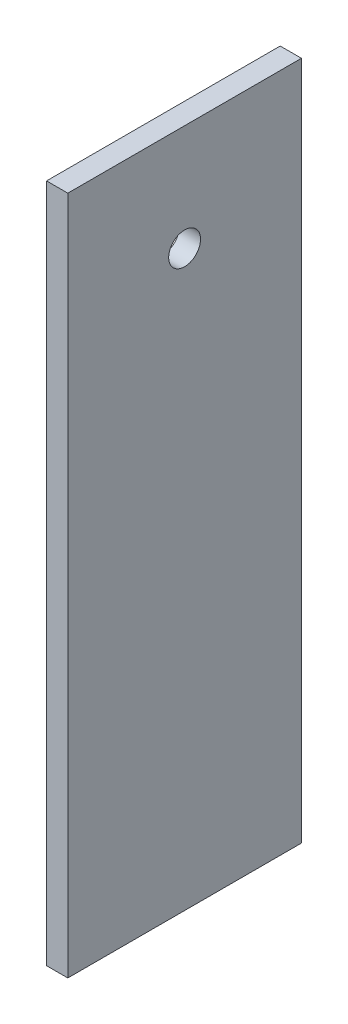
ISO-10303-21;
HEADER;
FILE_DESCRIPTION(('STEP AP214'),'2;1');
FILE_NAME('part.step','',(''),(''),'','','');
FILE_SCHEMA(('AUTOMOTIVE_DESIGN { 1 0 10303 214 1 1 1 1 }'));
ENDSEC;
DATA;
#1=APPLICATION_CONTEXT('core data for automotive mechanical design processes');
#2=APPLICATION_PROTOCOL_DEFINITION('international standard','automotive_design',2000,#1);
#3=PRODUCT_CONTEXT('',#1,'mechanical');
#4=PRODUCT('Part','Part','',(#3));
#5=PRODUCT_RELATED_PRODUCT_CATEGORY('part','',(#4));
#6=PRODUCT_DEFINITION_FORMATION('','',#4);
#7=PRODUCT_DEFINITION_CONTEXT('part definition',#1,'design');
#8=PRODUCT_DEFINITION('design','',#6,#7);
#9=PRODUCT_DEFINITION_SHAPE('','',#8);
#10=(LENGTH_UNIT() NAMED_UNIT(*) SI_UNIT(.MILLI.,.METRE.));
#11=(NAMED_UNIT(*) PLANE_ANGLE_UNIT() SI_UNIT($,.RADIAN.));
#12=(NAMED_UNIT(*) SI_UNIT($,.STERADIAN.) SOLID_ANGLE_UNIT());
#13=UNCERTAINTY_MEASURE_WITH_UNIT(LENGTH_MEASURE(1.E-05),#10,'distance_accuracy_value','');
#14=(GEOMETRIC_REPRESENTATION_CONTEXT(3) GLOBAL_UNCERTAINTY_ASSIGNED_CONTEXT((#13)) GLOBAL_UNIT_ASSIGNED_CONTEXT((#10,
#11,#12)) REPRESENTATION_CONTEXT('',''));
#15=CARTESIAN_POINT('',(0.,0.,0.));
#16=DIRECTION('',(0.,0.,1.));
#17=DIRECTION('',(1.,0.,0.));
#18=AXIS2_PLACEMENT_3D('',#15,#16,#17);
#19=CARTESIAN_POINT('',(50.,0.,0.));
#20=DIRECTION('',(1.,0.,0.));
#21=DIRECTION('',(0.,0.,-1.));
#22=AXIS2_PLACEMENT_3D('',#19,#20,#21);
#23=PLANE('',#22);
#24=DIRECTION('',(0.,1.,0.));
#25=VECTOR('',#24,1.);
#26=CARTESIAN_POINT('',(50.,800.,-275.));
#27=LINE('',#26,#25);
#28=CARTESIAN_POINT('',(50.,-800.,-275.));
#29=VERTEX_POINT('',#28);
#30=CARTESIAN_POINT('',(50.,800.,-275.));
#31=VERTEX_POINT('',#30);
#32=EDGE_CURVE('E102',#29,#31,#27,.T.);
#33=ORIENTED_EDGE('',*,*,#32,.T.);
#34=DIRECTION('',(0.,0.,1.));
#35=VECTOR('',#34,1.);
#36=CARTESIAN_POINT('',(50.,800.,275.));
#37=LINE('',#36,#35);
#38=CARTESIAN_POINT('',(50.,800.,275.));
#39=VERTEX_POINT('',#38);
#40=EDGE_CURVE('E97',#31,#39,#37,.T.);
#41=ORIENTED_EDGE('',*,*,#40,.T.);
#42=DIRECTION('',(0.,-1.,0.));
#43=VECTOR('',#42,1.);
#44=CARTESIAN_POINT('',(50.,800.,275.));
#45=LINE('',#44,#43);
#46=CARTESIAN_POINT('',(50.,-800.,275.));
#47=VERTEX_POINT('',#46);
#48=EDGE_CURVE('E100',#39,#47,#45,.T.);
#49=ORIENTED_EDGE('',*,*,#48,.T.);
#50=DIRECTION('',(0.,0.,-1.));
#51=VECTOR('',#50,1.);
#52=CARTESIAN_POINT('',(50.,-800.,275.));
#53=LINE('',#52,#51);
#54=EDGE_CURVE('E67',#47,#29,#53,.T.);
#55=ORIENTED_EDGE('',*,*,#54,.T.);
#56=EDGE_LOOP('',(#33,#41,#49,#55));
#57=FACE_BOUND('',#56,.T.);
#58=CARTESIAN_POINT('',(50.,550.,0.));
#59=DIRECTION('',(1.,0.,0.));
#60=DIRECTION('',(0.,0.,-1.));
#61=AXIS2_PLACEMENT_3D('',#58,#59,#60);
#62=CIRCLE('',#61,37.5);
#63=CARTESIAN_POINT('',(50.,550.,-37.5));
#64=VERTEX_POINT('',#63);
#65=EDGE_CURVE('E122',#64,#64,#62,.T.);
#66=ORIENTED_EDGE('',*,*,#65,.F.);
#67=EDGE_LOOP('',(#66));
#68=FACE_BOUND('',#67,.T.);
#69=ADVANCED_FACE('F49',(#57,#68),#23,.T.);
#70=CARTESIAN_POINT('',(0.,0.,0.));
#71=DIRECTION('',(1.,0.,0.));
#72=DIRECTION('',(0.,0.,-1.));
#73=AXIS2_PLACEMENT_3D('',#70,#71,#72);
#74=PLANE('',#73);
#75=DIRECTION('',(0.,1.,0.));
#76=VECTOR('',#75,1.);
#77=CARTESIAN_POINT('',(0.,800.,-275.));
#78=LINE('',#77,#76);
#79=CARTESIAN_POINT('',(0.,-800.,-275.));
#80=VERTEX_POINT('',#79);
#81=CARTESIAN_POINT('',(0.,800.,-275.));
#82=VERTEX_POINT('',#81);
#83=EDGE_CURVE('E118',#80,#82,#78,.T.);
#84=ORIENTED_EDGE('',*,*,#83,.F.);
#85=DIRECTION('',(0.,0.,-1.));
#86=VECTOR('',#85,1.);
#87=CARTESIAN_POINT('',(0.,-800.,275.));
#88=LINE('',#87,#86);
#89=CARTESIAN_POINT('',(0.,-800.,275.));
#90=VERTEX_POINT('',#89);
#91=EDGE_CURVE('E90',#90,#80,#88,.T.);
#92=ORIENTED_EDGE('',*,*,#91,.F.);
#93=DIRECTION('',(0.,-1.,0.));
#94=VECTOR('',#93,1.);
#95=CARTESIAN_POINT('',(0.,800.,275.));
#96=LINE('',#95,#94);
#97=CARTESIAN_POINT('',(0.,800.,275.));
#98=VERTEX_POINT('',#97);
#99=EDGE_CURVE('E84',#98,#90,#96,.T.);
#100=ORIENTED_EDGE('',*,*,#99,.F.);
#101=DIRECTION('',(0.,0.,1.));
#102=VECTOR('',#101,1.);
#103=CARTESIAN_POINT('',(0.,800.,275.));
#104=LINE('',#103,#102);
#105=EDGE_CURVE('E107',#82,#98,#104,.T.);
#106=ORIENTED_EDGE('',*,*,#105,.F.);
#107=EDGE_LOOP('',(#84,#92,#100,#106));
#108=FACE_BOUND('',#107,.T.);
#109=CARTESIAN_POINT('',(0.,550.,0.));
#110=DIRECTION('',(1.,0.,0.));
#111=DIRECTION('',(0.,0.,-1.));
#112=AXIS2_PLACEMENT_3D('',#109,#110,#111);
#113=CIRCLE('',#112,37.5);
#114=CARTESIAN_POINT('',(0.,550.,-37.5));
#115=VERTEX_POINT('',#114);
#116=EDGE_CURVE('E140',#115,#115,#113,.T.);
#117=ORIENTED_EDGE('',*,*,#116,.T.);
#118=EDGE_LOOP('',(#117));
#119=FACE_BOUND('',#118,.T.);
#120=ADVANCED_FACE('F135',(#108,#119),#74,.F.);
#121=CARTESIAN_POINT('',(50.,800.,-275.));
#122=DIRECTION('',(0.,0.,1.));
#123=DIRECTION('',(0.,-1.,0.));
#124=AXIS2_PLACEMENT_3D('',#121,#122,#123);
#125=PLANE('',#124);
#126=ORIENTED_EDGE('',*,*,#83,.T.);
#127=DIRECTION('',(-1.,0.,0.));
#128=VECTOR('',#127,1.);
#129=CARTESIAN_POINT('',(50.,800.,-275.));
#130=LINE('',#129,#128);
#131=EDGE_CURVE('E11',#31,#82,#130,.T.);
#132=ORIENTED_EDGE('',*,*,#131,.F.);
#133=ORIENTED_EDGE('',*,*,#32,.F.);
#134=DIRECTION('',(-1.,0.,0.));
#135=VECTOR('',#134,1.);
#136=CARTESIAN_POINT('',(50.,-800.,-275.));
#137=LINE('',#136,#135);
#138=EDGE_CURVE('E114',#29,#80,#137,.T.);
#139=ORIENTED_EDGE('',*,*,#138,.T.);
#140=EDGE_LOOP('',(#126,#132,#133,#139));
#141=FACE_BOUND('',#140,.T.);
#142=ADVANCED_FACE('F51',(#141),#125,.F.);
#143=CARTESIAN_POINT('',(50.,800.,275.));
#144=DIRECTION('',(0.,-1.,0.));
#145=DIRECTION('',(0.,0.,-1.));
#146=AXIS2_PLACEMENT_3D('',#143,#144,#145);
#147=PLANE('',#146);
#148=ORIENTED_EDGE('',*,*,#105,.T.);
#149=DIRECTION('',(-1.,0.,0.));
#150=VECTOR('',#149,1.);
#151=CARTESIAN_POINT('',(50.,800.,275.));
#152=LINE('',#151,#150);
#153=EDGE_CURVE('E59',#39,#98,#152,.T.);
#154=ORIENTED_EDGE('',*,*,#153,.F.);
#155=ORIENTED_EDGE('',*,*,#40,.F.);
#156=ORIENTED_EDGE('',*,*,#131,.T.);
#157=EDGE_LOOP('',(#148,#154,#155,#156));
#158=FACE_BOUND('',#157,.T.);
#159=ADVANCED_FACE('F106',(#158),#147,.F.);
#160=CARTESIAN_POINT('',(50.,800.,275.));
#161=DIRECTION('',(0.,0.,-1.));
#162=DIRECTION('',(0.,1.,0.));
#163=AXIS2_PLACEMENT_3D('',#160,#161,#162);
#164=PLANE('',#163);
#165=ORIENTED_EDGE('',*,*,#99,.T.);
#166=DIRECTION('',(-1.,0.,0.));
#167=VECTOR('',#166,1.);
#168=CARTESIAN_POINT('',(50.,-800.,275.));
#169=LINE('',#168,#167);
#170=EDGE_CURVE('E109',#47,#90,#169,.T.);
#171=ORIENTED_EDGE('',*,*,#170,.F.);
#172=ORIENTED_EDGE('',*,*,#48,.F.);
#173=ORIENTED_EDGE('',*,*,#153,.T.);
#174=EDGE_LOOP('',(#165,#171,#172,#173));
#175=FACE_BOUND('',#174,.T.);
#176=ADVANCED_FACE('F110',(#175),#164,.F.);
#177=CARTESIAN_POINT('',(50.,-800.,275.));
#178=DIRECTION('',(0.,1.,0.));
#179=DIRECTION('',(0.,0.,1.));
#180=AXIS2_PLACEMENT_3D('',#177,#178,#179);
#181=PLANE('',#180);
#182=ORIENTED_EDGE('',*,*,#91,.T.);
#183=ORIENTED_EDGE('',*,*,#138,.F.);
#184=ORIENTED_EDGE('',*,*,#54,.F.);
#185=ORIENTED_EDGE('',*,*,#170,.T.);
#186=EDGE_LOOP('',(#182,#183,#184,#185));
#187=FACE_BOUND('',#186,.T.);
#188=ADVANCED_FACE('F132',(#187),#181,.F.);
#189=CARTESIAN_POINT('',(50.,550.,0.));
#190=DIRECTION('',(-1.,0.,0.));
#191=DIRECTION('',(0.,0.,1.));
#192=AXIS2_PLACEMENT_3D('',#189,#190,#191);
#193=CYLINDRICAL_SURFACE('',#192,37.5);
#194=ORIENTED_EDGE('',*,*,#65,.T.);
#195=EDGE_LOOP('',(#194));
#196=FACE_BOUND('',#195,.T.);
#197=ORIENTED_EDGE('',*,*,#116,.F.);
#198=EDGE_LOOP('',(#197));
#199=FACE_BOUND('',#198,.T.);
#200=ADVANCED_FACE('F148',(#196,#199),#193,.F.);
#201=CLOSED_SHELL('',(#69,#120,#142,#159,#176,#188,#200));
#202=MANIFOLD_SOLID_BREP('B2',#201);
#203=ADVANCED_BREP_SHAPE_REPRESENTATION('',(#18,#202),#14);
#204=SHAPE_DEFINITION_REPRESENTATION(#9,#203);
ENDSEC;
END-ISO-10303-21;
